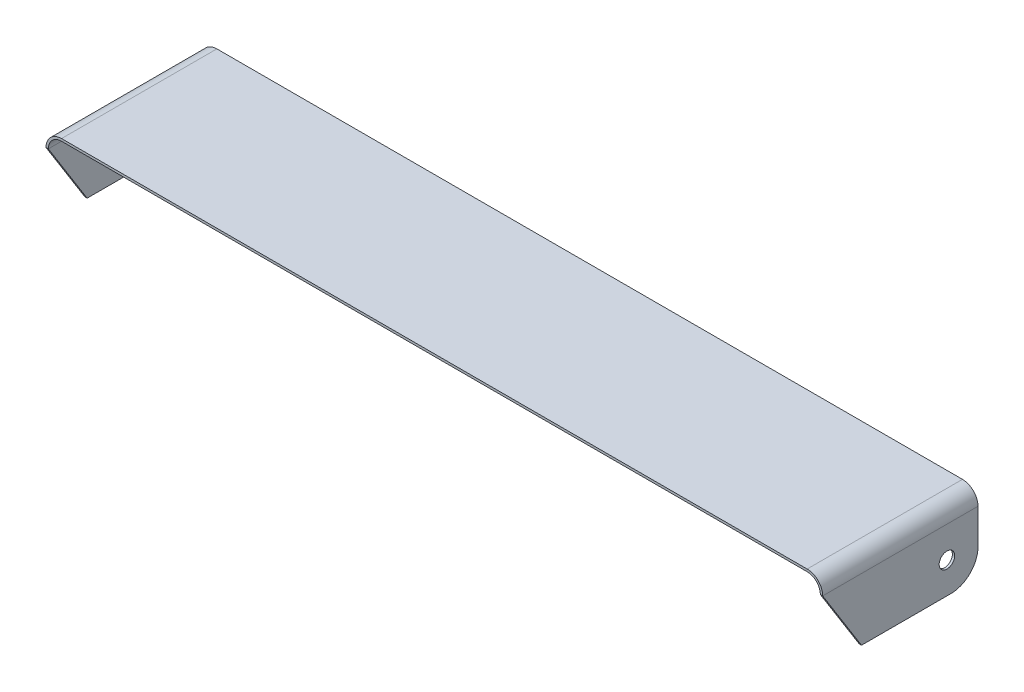
ISO-10303-21;
HEADER;
FILE_DESCRIPTION(('STEP AP214'),'2;1');
FILE_NAME('part.step','',(''),(''),'','','');
FILE_SCHEMA(('AUTOMOTIVE_DESIGN { 1 0 10303 214 1 1 1 1 }'));
ENDSEC;
DATA;
#1=APPLICATION_CONTEXT('core data for automotive mechanical design processes');
#2=APPLICATION_PROTOCOL_DEFINITION('international standard','automotive_design',2000,#1);
#3=PRODUCT_CONTEXT('',#1,'mechanical');
#4=PRODUCT('Part','Part','',(#3));
#5=PRODUCT_RELATED_PRODUCT_CATEGORY('part','',(#4));
#6=PRODUCT_DEFINITION_FORMATION('','',#4);
#7=PRODUCT_DEFINITION_CONTEXT('part definition',#1,'design');
#8=PRODUCT_DEFINITION('design','',#6,#7);
#9=PRODUCT_DEFINITION_SHAPE('','',#8);
#10=(LENGTH_UNIT() NAMED_UNIT(*) SI_UNIT(.MILLI.,.METRE.));
#11=(NAMED_UNIT(*) PLANE_ANGLE_UNIT() SI_UNIT($,.RADIAN.));
#12=(NAMED_UNIT(*) SI_UNIT($,.STERADIAN.) SOLID_ANGLE_UNIT());
#13=UNCERTAINTY_MEASURE_WITH_UNIT(LENGTH_MEASURE(1.E-05),#10,'distance_accuracy_value','');
#14=(GEOMETRIC_REPRESENTATION_CONTEXT(3) GLOBAL_UNCERTAINTY_ASSIGNED_CONTEXT((#13)) GLOBAL_UNIT_ASSIGNED_CONTEXT((#10,
#11,#12)) REPRESENTATION_CONTEXT('',''));
#15=CARTESIAN_POINT('',(0.,0.,0.));
#16=DIRECTION('',(0.,0.,1.));
#17=DIRECTION('',(1.,0.,0.));
#18=AXIS2_PLACEMENT_3D('',#15,#16,#17);
#19=CARTESIAN_POINT('',(-500.,0.,100.));
#20=DIRECTION('',(0.,1.,0.));
#21=DIRECTION('',(0.,0.,1.));
#22=AXIS2_PLACEMENT_3D('',#19,#20,#21);
#23=PLANE('',#22);
#24=DIRECTION('',(0.,0.,-1.));
#25=VECTOR('',#24,1.);
#26=CARTESIAN_POINT('',(-500.,0.,100.));
#27=LINE('',#26,#25);
#28=CARTESIAN_POINT('',(-500.,0.,50.));
#29=VERTEX_POINT('',#28);
#30=CARTESIAN_POINT('',(-500.,0.,-65.));
#31=VERTEX_POINT('',#30);
#32=EDGE_CURVE('E161',#29,#31,#27,.T.);
#33=ORIENTED_EDGE('',*,*,#32,.T.);
#34=DIRECTION('',(1.,0.,0.));
#35=VECTOR('',#34,1.);
#36=CARTESIAN_POINT('',(-497.,0.,-65.));
#37=LINE('',#36,#35);
#38=CARTESIAN_POINT('',(-497.,0.,-65.));
#39=VERTEX_POINT('',#38);
#40=EDGE_CURVE('E226',#31,#39,#37,.T.);
#41=ORIENTED_EDGE('',*,*,#40,.T.);
#42=DIRECTION('',(0.,0.,-1.));
#43=VECTOR('',#42,1.);
#44=CARTESIAN_POINT('',(-497.,0.,100.));
#45=LINE('',#44,#43);
#46=CARTESIAN_POINT('',(-497.,0.,50.));
#47=VERTEX_POINT('',#46);
#48=EDGE_CURVE('E218',#47,#39,#45,.T.);
#49=ORIENTED_EDGE('',*,*,#48,.F.);
#50=DIRECTION('',(1.,0.,0.));
#51=VECTOR('',#50,1.);
#52=CARTESIAN_POINT('',(-500.,0.,50.));
#53=LINE('',#52,#51);
#54=EDGE_CURVE('E272',#29,#47,#53,.T.);
#55=ORIENTED_EDGE('',*,*,#54,.F.);
#56=EDGE_LOOP('',(#33,#41,#49,#55));
#57=FACE_BOUND('',#56,.T.);
#58=ADVANCED_FACE('F38',(#57),#23,.F.);
#59=CARTESIAN_POINT('',(-497.,0.,100.));
#60=DIRECTION('',(-1.,0.,0.));
#61=DIRECTION('',(0.,0.,1.));
#62=AXIS2_PLACEMENT_3D('',#59,#60,#61);
#63=PLANE('',#62);
#64=CARTESIAN_POINT('',(-497.,40.,-60.));
#65=DIRECTION('',(-1.,0.,0.));
#66=DIRECTION('',(0.,0.,1.));
#67=AXIS2_PLACEMENT_3D('',#64,#65,#66);
#68=CIRCLE('',#67,10.);
#69=CARTESIAN_POINT('',(-497.,40.,-50.));
#70=VERTEX_POINT('',#69);
#71=EDGE_CURVE('E364',#70,#70,#68,.T.);
#72=ORIENTED_EDGE('',*,*,#71,.T.);
#73=EDGE_LOOP('',(#72));
#74=FACE_BOUND('',#73,.T.);
#75=ORIENTED_EDGE('',*,*,#48,.T.);
#76=CARTESIAN_POINT('',(-497.,35.,-65.));
#77=DIRECTION('',(-1.,0.,0.));
#78=DIRECTION('',(0.,0.,1.));
#79=AXIS2_PLACEMENT_3D('',#76,#77,#78);
#80=CIRCLE('',#79,35.);
#81=CARTESIAN_POINT('',(-497.,35.,-100.));
#82=VERTEX_POINT('',#81);
#83=EDGE_CURVE('E230',#39,#82,#80,.F.);
#84=ORIENTED_EDGE('',*,*,#83,.T.);
#85=DIRECTION('',(0.,1.,0.));
#86=VECTOR('',#85,1.);
#87=CARTESIAN_POINT('',(-497.,0.,-100.));
#88=LINE('',#87,#86);
#89=CARTESIAN_POINT('',(-497.,79.9999999999999,-100.));
#90=VERTEX_POINT('',#89);
#91=EDGE_CURVE('E319',#82,#90,#88,.T.);
#92=ORIENTED_EDGE('',*,*,#91,.T.);
#93=DIRECTION('',(0.,0.,-1.));
#94=VECTOR('',#93,1.);
#95=CARTESIAN_POINT('',(-497.,79.9999999999999,100.));
#96=LINE('',#95,#94);
#97=CARTESIAN_POINT('',(-497.,79.9999999999999,100.));
#98=VERTEX_POINT('',#97);
#99=EDGE_CURVE('E214',#98,#90,#96,.T.);
#100=ORIENTED_EDGE('',*,*,#99,.F.);
#101=DIRECTION('',(0.,-0.847998304005088,-0.529998940003181));
#102=VECTOR('',#101,1.);
#103=CARTESIAN_POINT('',(-497.,22.4719101123596,64.0449438202248));
#104=LINE('',#103,#102);
#105=EDGE_CURVE('E145',#98,#47,#104,.T.);
#106=ORIENTED_EDGE('',*,*,#105,.T.);
#107=EDGE_LOOP('',(#75,#84,#92,#100,#106));
#108=FACE_BOUND('',#107,.T.);
#109=ADVANCED_FACE('F334',(#74,#108),#63,.F.);
#110=CARTESIAN_POINT('',(-480.,80.,100.));
#111=DIRECTION('',(0.,0.,-1.));
#112=DIRECTION('',(-1.,0.,0.));
#113=AXIS2_PLACEMENT_3D('',#110,#111,#112);
#114=CYLINDRICAL_SURFACE('',#113,17.);
#115=CARTESIAN_POINT('',(-480.,80.,-100.));
#116=DIRECTION('',(0.,0.,-1.));
#117=DIRECTION('',(-1.,0.,0.));
#118=AXIS2_PLACEMENT_3D('',#115,#116,#117);
#119=CIRCLE('',#118,17.);
#120=CARTESIAN_POINT('',(-480.,97.,-100.));
#121=VERTEX_POINT('',#120);
#122=EDGE_CURVE('E293',#90,#121,#119,.T.);
#123=ORIENTED_EDGE('',*,*,#122,.T.);
#124=DIRECTION('',(0.,0.,-1.));
#125=VECTOR('',#124,1.);
#126=CARTESIAN_POINT('',(-480.,97.,100.));
#127=LINE('',#126,#125);
#128=CARTESIAN_POINT('',(-480.,97.,100.));
#129=VERTEX_POINT('',#128);
#130=EDGE_CURVE('E210',#129,#121,#127,.T.);
#131=ORIENTED_EDGE('',*,*,#130,.F.);
#132=CARTESIAN_POINT('',(-480.,80.,100.));
#133=DIRECTION('',(0.,0.,-1.));
#134=DIRECTION('',(-1.,0.,0.));
#135=AXIS2_PLACEMENT_3D('',#132,#133,#134);
#136=CIRCLE('',#135,17.);
#137=EDGE_CURVE('E305',#98,#129,#136,.T.);
#138=ORIENTED_EDGE('',*,*,#137,.F.);
#139=ORIENTED_EDGE('',*,*,#99,.T.);
#140=EDGE_LOOP('',(#123,#131,#138,#139));
#141=FACE_BOUND('',#140,.T.);
#142=ADVANCED_FACE('F324',(#141),#114,.F.);
#143=CARTESIAN_POINT('',(-480.,97.,100.));
#144=DIRECTION('',(0.,1.,0.));
#145=DIRECTION('',(-1.,0.,0.));
#146=AXIS2_PLACEMENT_3D('',#143,#144,#145);
#147=PLANE('',#146);
#148=DIRECTION('',(1.,0.,0.));
#149=VECTOR('',#148,1.);
#150=CARTESIAN_POINT('',(-480.,97.,-100.));
#151=LINE('',#150,#149);
#152=CARTESIAN_POINT('',(480.,97.,-100.));
#153=VERTEX_POINT('',#152);
#154=EDGE_CURVE('E288',#121,#153,#151,.T.);
#155=ORIENTED_EDGE('',*,*,#154,.T.);
#156=DIRECTION('',(0.,0.,-1.));
#157=VECTOR('',#156,1.);
#158=CARTESIAN_POINT('',(480.,97.,100.));
#159=LINE('',#158,#157);
#160=CARTESIAN_POINT('',(480.,97.,100.));
#161=VERTEX_POINT('',#160);
#162=EDGE_CURVE('E206',#161,#153,#159,.T.);
#163=ORIENTED_EDGE('',*,*,#162,.F.);
#164=DIRECTION('',(1.,0.,0.));
#165=VECTOR('',#164,1.);
#166=CARTESIAN_POINT('',(-480.,97.,100.));
#167=LINE('',#166,#165);
#168=EDGE_CURVE('E277',#129,#161,#167,.T.);
#169=ORIENTED_EDGE('',*,*,#168,.F.);
#170=ORIENTED_EDGE('',*,*,#130,.T.);
#171=EDGE_LOOP('',(#155,#163,#169,#170));
#172=FACE_BOUND('',#171,.T.);
#173=ADVANCED_FACE('F326',(#172),#147,.F.);
#174=CARTESIAN_POINT('',(480.,80.,100.));
#175=DIRECTION('',(0.,0.,-1.));
#176=DIRECTION('',(-1.,0.,0.));
#177=AXIS2_PLACEMENT_3D('',#174,#175,#176);
#178=CYLINDRICAL_SURFACE('',#177,17.);
#179=CARTESIAN_POINT('',(480.,80.,-100.));
#180=DIRECTION('',(0.,0.,-1.));
#181=DIRECTION('',(-1.,0.,0.));
#182=AXIS2_PLACEMENT_3D('',#179,#180,#181);
#183=CIRCLE('',#182,17.);
#184=CARTESIAN_POINT('',(497.,79.9999999999999,-100.));
#185=VERTEX_POINT('',#184);
#186=EDGE_CURVE('E285',#153,#185,#183,.T.);
#187=ORIENTED_EDGE('',*,*,#186,.T.);
#188=DIRECTION('',(0.,0.,-1.));
#189=VECTOR('',#188,1.);
#190=CARTESIAN_POINT('',(497.,79.9999999999999,100.));
#191=LINE('',#190,#189);
#192=CARTESIAN_POINT('',(497.,79.9999999999999,100.));
#193=VERTEX_POINT('',#192);
#194=EDGE_CURVE('E202',#193,#185,#191,.T.);
#195=ORIENTED_EDGE('',*,*,#194,.F.);
#196=CARTESIAN_POINT('',(480.,80.,100.));
#197=DIRECTION('',(0.,0.,-1.));
#198=DIRECTION('',(-1.,0.,0.));
#199=AXIS2_PLACEMENT_3D('',#196,#197,#198);
#200=CIRCLE('',#199,17.);
#201=EDGE_CURVE('E275',#161,#193,#200,.T.);
#202=ORIENTED_EDGE('',*,*,#201,.F.);
#203=ORIENTED_EDGE('',*,*,#162,.T.);
#204=EDGE_LOOP('',(#187,#195,#202,#203));
#205=FACE_BOUND('',#204,.T.);
#206=ADVANCED_FACE('F283',(#205),#178,.F.);
#207=CARTESIAN_POINT('',(497.,79.9999999999999,100.));
#208=DIRECTION('',(1.,0.,0.));
#209=DIRECTION('',(0.,0.,-1.));
#210=AXIS2_PLACEMENT_3D('',#207,#208,#209);
#211=PLANE('',#210);
#212=CARTESIAN_POINT('',(497.,40.,-60.));
#213=DIRECTION('',(1.,0.,0.));
#214=DIRECTION('',(0.,0.,-1.));
#215=AXIS2_PLACEMENT_3D('',#212,#213,#214);
#216=CIRCLE('',#215,10.);
#217=CARTESIAN_POINT('',(497.,40.,-70.));
#218=VERTEX_POINT('',#217);
#219=EDGE_CURVE('E369',#218,#218,#216,.T.);
#220=ORIENTED_EDGE('',*,*,#219,.T.);
#221=EDGE_LOOP('',(#220));
#222=FACE_BOUND('',#221,.T.);
#223=DIRECTION('',(0.,-1.,0.));
#224=VECTOR('',#223,1.);
#225=CARTESIAN_POINT('',(497.,79.9999999999999,-100.));
#226=LINE('',#225,#224);
#227=CARTESIAN_POINT('',(497.,35.,-100.));
#228=VERTEX_POINT('',#227);
#229=EDGE_CURVE('E260',#185,#228,#226,.T.);
#230=ORIENTED_EDGE('',*,*,#229,.T.);
#231=CARTESIAN_POINT('',(497.,35.,-65.));
#232=DIRECTION('',(1.,0.,0.));
#233=DIRECTION('',(0.,0.,-1.));
#234=AXIS2_PLACEMENT_3D('',#231,#232,#233);
#235=CIRCLE('',#234,35.);
#236=CARTESIAN_POINT('',(497.,0.,-65.));
#237=VERTEX_POINT('',#236);
#238=EDGE_CURVE('E11',#228,#237,#235,.F.);
#239=ORIENTED_EDGE('',*,*,#238,.T.);
#240=DIRECTION('',(0.,0.,-1.));
#241=VECTOR('',#240,1.);
#242=CARTESIAN_POINT('',(497.,0.,100.));
#243=LINE('',#242,#241);
#244=CARTESIAN_POINT('',(497.,0.,50.));
#245=VERTEX_POINT('',#244);
#246=EDGE_CURVE('E199',#245,#237,#243,.T.);
#247=ORIENTED_EDGE('',*,*,#246,.F.);
#248=DIRECTION('',(0.,0.847998304005088,0.529998940003181));
#249=VECTOR('',#248,1.);
#250=CARTESIAN_POINT('',(497.,79.9999999999999,100.));
#251=LINE('',#250,#249);
#252=EDGE_CURVE('E267',#245,#193,#251,.T.);
#253=ORIENTED_EDGE('',*,*,#252,.T.);
#254=ORIENTED_EDGE('',*,*,#194,.T.);
#255=EDGE_LOOP('',(#230,#239,#247,#253,#254));
#256=FACE_BOUND('',#255,.T.);
#257=ADVANCED_FACE('F266',(#222,#256),#211,.F.);
#258=CARTESIAN_POINT('',(497.,0.,100.));
#259=DIRECTION('',(0.,1.,0.));
#260=DIRECTION('',(0.,0.,1.));
#261=AXIS2_PLACEMENT_3D('',#258,#259,#260);
#262=PLANE('',#261);
#263=ORIENTED_EDGE('',*,*,#246,.T.);
#264=DIRECTION('',(1.,0.,0.));
#265=VECTOR('',#264,1.);
#266=CARTESIAN_POINT('',(500.,0.,-65.));
#267=LINE('',#266,#265);
#268=CARTESIAN_POINT('',(500.,0.,-65.));
#269=VERTEX_POINT('',#268);
#270=EDGE_CURVE('E242',#237,#269,#267,.T.);
#271=ORIENTED_EDGE('',*,*,#270,.T.);
#272=DIRECTION('',(0.,0.,-1.));
#273=VECTOR('',#272,1.);
#274=CARTESIAN_POINT('',(500.,0.,100.));
#275=LINE('',#274,#273);
#276=CARTESIAN_POINT('',(500.,0.,50.));
#277=VERTEX_POINT('',#276);
#278=EDGE_CURVE('E195',#277,#269,#275,.T.);
#279=ORIENTED_EDGE('',*,*,#278,.F.);
#280=EDGE_CURVE('E150',#245,#277,#53,.T.);
#281=ORIENTED_EDGE('',*,*,#280,.F.);
#282=EDGE_LOOP('',(#263,#271,#279,#281));
#283=FACE_BOUND('',#282,.T.);
#284=ADVANCED_FACE('F263',(#283),#262,.F.);
#285=CARTESIAN_POINT('',(500.,79.9999999999999,100.));
#286=DIRECTION('',(-1.,0.,0.));
#287=DIRECTION('',(0.,0.,1.));
#288=AXIS2_PLACEMENT_3D('',#285,#286,#287);
#289=PLANE('',#288);
#290=CARTESIAN_POINT('',(500.,40.,-60.));
#291=DIRECTION('',(-1.,0.,0.));
#292=DIRECTION('',(0.,0.,1.));
#293=AXIS2_PLACEMENT_3D('',#290,#291,#292);
#294=CIRCLE('',#293,10.);
#295=CARTESIAN_POINT('',(500.,40.,-50.));
#296=VERTEX_POINT('',#295);
#297=EDGE_CURVE('E373',#296,#296,#294,.T.);
#298=ORIENTED_EDGE('',*,*,#297,.T.);
#299=EDGE_LOOP('',(#298));
#300=FACE_BOUND('',#299,.T.);
#301=ORIENTED_EDGE('',*,*,#278,.T.);
#302=CARTESIAN_POINT('',(500.,35.,-65.));
#303=DIRECTION('',(-1.,0.,0.));
#304=DIRECTION('',(0.,0.,1.));
#305=AXIS2_PLACEMENT_3D('',#302,#303,#304);
#306=CIRCLE('',#305,35.);
#307=CARTESIAN_POINT('',(500.,35.,-100.));
#308=VERTEX_POINT('',#307);
#309=EDGE_CURVE('E47',#269,#308,#306,.F.);
#310=ORIENTED_EDGE('',*,*,#309,.T.);
#311=DIRECTION('',(0.,1.,0.));
#312=VECTOR('',#311,1.);
#313=CARTESIAN_POINT('',(500.,79.9999999999999,-100.));
#314=LINE('',#313,#312);
#315=CARTESIAN_POINT('',(500.,79.9999999999999,-100.));
#316=VERTEX_POINT('',#315);
#317=EDGE_CURVE('E249',#308,#316,#314,.T.);
#318=ORIENTED_EDGE('',*,*,#317,.T.);
#319=DIRECTION('',(0.,0.,-1.));
#320=VECTOR('',#319,1.);
#321=CARTESIAN_POINT('',(500.,79.9999999999999,100.));
#322=LINE('',#321,#320);
#323=CARTESIAN_POINT('',(500.,79.9999999999999,100.));
#324=VERTEX_POINT('',#323);
#325=EDGE_CURVE('E191',#324,#316,#322,.T.);
#326=ORIENTED_EDGE('',*,*,#325,.F.);
#327=DIRECTION('',(0.,0.847998304005088,0.529998940003181));
#328=VECTOR('',#327,1.);
#329=CARTESIAN_POINT('',(500.,0.,50.));
#330=LINE('',#329,#328);
#331=EDGE_CURVE('E163',#277,#324,#330,.T.);
#332=ORIENTED_EDGE('',*,*,#331,.F.);
#333=EDGE_LOOP('',(#301,#310,#318,#326,#332));
#334=FACE_BOUND('',#333,.T.);
#335=ADVANCED_FACE('F247',(#300,#334),#289,.F.);
#336=CARTESIAN_POINT('',(480.,80.,100.));
#337=DIRECTION('',(0.,0.,-1.));
#338=DIRECTION('',(-1.,0.,0.));
#339=AXIS2_PLACEMENT_3D('',#336,#337,#338);
#340=CYLINDRICAL_SURFACE('',#339,20.);
#341=CARTESIAN_POINT('',(480.,80.,-100.));
#342=DIRECTION('',(0.,0.,1.));
#343=DIRECTION('',(-1.,0.,0.));
#344=AXIS2_PLACEMENT_3D('',#341,#342,#343);
#345=CIRCLE('',#344,20.);
#346=CARTESIAN_POINT('',(480.,100.,-100.));
#347=VERTEX_POINT('',#346);
#348=EDGE_CURVE('E258',#316,#347,#345,.T.);
#349=ORIENTED_EDGE('',*,*,#348,.T.);
#350=DIRECTION('',(0.,0.,-1.));
#351=VECTOR('',#350,1.);
#352=CARTESIAN_POINT('',(480.,100.,100.));
#353=LINE('',#352,#351);
#354=CARTESIAN_POINT('',(480.,100.,100.));
#355=VERTEX_POINT('',#354);
#356=EDGE_CURVE('E183',#355,#347,#353,.T.);
#357=ORIENTED_EDGE('',*,*,#356,.F.);
#358=CARTESIAN_POINT('',(480.,80.,100.));
#359=DIRECTION('',(0.,0.,1.));
#360=DIRECTION('',(-1.,0.,0.));
#361=AXIS2_PLACEMENT_3D('',#358,#359,#360);
#362=CIRCLE('',#361,20.);
#363=EDGE_CURVE('E281',#324,#355,#362,.T.);
#364=ORIENTED_EDGE('',*,*,#363,.F.);
#365=ORIENTED_EDGE('',*,*,#325,.T.);
#366=EDGE_LOOP('',(#349,#357,#364,#365));
#367=FACE_BOUND('',#366,.T.);
#368=ADVANCED_FACE('F394',(#367),#340,.T.);
#369=CARTESIAN_POINT('',(-480.,100.,100.));
#370=DIRECTION('',(0.,-1.,0.));
#371=DIRECTION('',(0.,0.,-1.));
#372=AXIS2_PLACEMENT_3D('',#369,#370,#371);
#373=PLANE('',#372);
#374=DIRECTION('',(-1.,0.,0.));
#375=VECTOR('',#374,1.);
#376=CARTESIAN_POINT('',(-480.,100.,-100.));
#377=LINE('',#376,#375);
#378=CARTESIAN_POINT('',(-480.,100.,-100.));
#379=VERTEX_POINT('',#378);
#380=EDGE_CURVE('E299',#347,#379,#377,.T.);
#381=ORIENTED_EDGE('',*,*,#380,.T.);
#382=DIRECTION('',(0.,0.,-1.));
#383=VECTOR('',#382,1.);
#384=CARTESIAN_POINT('',(-480.,100.,100.));
#385=LINE('',#384,#383);
#386=CARTESIAN_POINT('',(-480.,100.,100.));
#387=VERTEX_POINT('',#386);
#388=EDGE_CURVE('E179',#387,#379,#385,.T.);
#389=ORIENTED_EDGE('',*,*,#388,.F.);
#390=DIRECTION('',(-1.,0.,0.));
#391=VECTOR('',#390,1.);
#392=CARTESIAN_POINT('',(-480.,100.,100.));
#393=LINE('',#392,#391);
#394=EDGE_CURVE('E169',#355,#387,#393,.T.);
#395=ORIENTED_EDGE('',*,*,#394,.F.);
#396=ORIENTED_EDGE('',*,*,#356,.T.);
#397=EDGE_LOOP('',(#381,#389,#395,#396));
#398=FACE_BOUND('',#397,.T.);
#399=ADVANCED_FACE('F397',(#398),#373,.F.);
#400=CARTESIAN_POINT('',(-480.,80.,100.));
#401=DIRECTION('',(0.,0.,-1.));
#402=DIRECTION('',(-1.,0.,0.));
#403=AXIS2_PLACEMENT_3D('',#400,#401,#402);
#404=CYLINDRICAL_SURFACE('',#403,20.);
#405=CARTESIAN_POINT('',(-480.,80.,-100.));
#406=DIRECTION('',(0.,0.,1.));
#407=DIRECTION('',(-1.,0.,0.));
#408=AXIS2_PLACEMENT_3D('',#405,#406,#407);
#409=CIRCLE('',#408,20.);
#410=CARTESIAN_POINT('',(-500.,79.9999999999999,-100.));
#411=VERTEX_POINT('',#410);
#412=EDGE_CURVE('E177',#379,#411,#409,.T.);
#413=ORIENTED_EDGE('',*,*,#412,.T.);
#414=DIRECTION('',(0.,0.,-1.));
#415=VECTOR('',#414,1.);
#416=CARTESIAN_POINT('',(-500.,79.9999999999999,100.));
#417=LINE('',#416,#415);
#418=CARTESIAN_POINT('',(-500.,79.9999999999999,100.));
#419=VERTEX_POINT('',#418);
#420=EDGE_CURVE('E158',#419,#411,#417,.T.);
#421=ORIENTED_EDGE('',*,*,#420,.F.);
#422=CARTESIAN_POINT('',(-480.,80.,100.));
#423=DIRECTION('',(0.,0.,1.));
#424=DIRECTION('',(-1.,0.,0.));
#425=AXIS2_PLACEMENT_3D('',#422,#423,#424);
#426=CIRCLE('',#425,20.);
#427=EDGE_CURVE('E166',#387,#419,#426,.T.);
#428=ORIENTED_EDGE('',*,*,#427,.F.);
#429=ORIENTED_EDGE('',*,*,#388,.T.);
#430=EDGE_LOOP('',(#413,#421,#428,#429));
#431=FACE_BOUND('',#430,.T.);
#432=ADVANCED_FACE('F175',(#431),#404,.T.);
#433=CARTESIAN_POINT('',(-500.,0.,100.));
#434=DIRECTION('',(1.,0.,0.));
#435=DIRECTION('',(0.,0.,-1.));
#436=AXIS2_PLACEMENT_3D('',#433,#434,#435);
#437=PLANE('',#436);
#438=CARTESIAN_POINT('',(-500.,40.,-60.));
#439=DIRECTION('',(-1.,0.,0.));
#440=DIRECTION('',(0.,0.,1.));
#441=AXIS2_PLACEMENT_3D('',#438,#439,#440);
#442=CIRCLE('',#441,10.);
#443=CARTESIAN_POINT('',(-500.,40.,-50.));
#444=VERTEX_POINT('',#443);
#445=EDGE_CURVE('E374',#444,#444,#442,.T.);
#446=ORIENTED_EDGE('',*,*,#445,.F.);
#447=EDGE_LOOP('',(#446));
#448=FACE_BOUND('',#447,.T.);
#449=DIRECTION('',(0.,-1.,0.));
#450=VECTOR('',#449,1.);
#451=CARTESIAN_POINT('',(-500.,0.,-100.));
#452=LINE('',#451,#450);
#453=CARTESIAN_POINT('',(-500.,35.,-100.));
#454=VERTEX_POINT('',#453);
#455=EDGE_CURVE('E303',#411,#454,#452,.T.);
#456=ORIENTED_EDGE('',*,*,#455,.T.);
#457=CARTESIAN_POINT('',(-500.,35.,-65.));
#458=DIRECTION('',(1.,0.,0.));
#459=DIRECTION('',(0.,0.,-1.));
#460=AXIS2_PLACEMENT_3D('',#457,#458,#459);
#461=CIRCLE('',#460,35.);
#462=EDGE_CURVE('E239',#454,#31,#461,.F.);
#463=ORIENTED_EDGE('',*,*,#462,.T.);
#464=ORIENTED_EDGE('',*,*,#32,.F.);
#465=DIRECTION('',(0.,0.847998304005088,0.529998940003181));
#466=VECTOR('',#465,1.);
#467=CARTESIAN_POINT('',(-500.,0.,50.));
#468=LINE('',#467,#466);
#469=EDGE_CURVE('E142',#29,#419,#468,.T.);
#470=ORIENTED_EDGE('',*,*,#469,.T.);
#471=ORIENTED_EDGE('',*,*,#420,.T.);
#472=EDGE_LOOP('',(#456,#463,#464,#470,#471));
#473=FACE_BOUND('',#472,.T.);
#474=ADVANCED_FACE('F156',(#448,#473),#437,.F.);
#475=CARTESIAN_POINT('',(-480.,80.,100.));
#476=DIRECTION('',(0.,0.,-1.));
#477=DIRECTION('',(-1.,0.,0.));
#478=AXIS2_PLACEMENT_3D('',#475,#476,#477);
#479=PLANE('',#478);
#480=ORIENTED_EDGE('',*,*,#427,.T.);
#481=DIRECTION('',(1.,0.,0.));
#482=VECTOR('',#481,1.);
#483=CARTESIAN_POINT('',(-500.,79.9999999999999,100.));
#484=LINE('',#483,#482);
#485=EDGE_CURVE('E139',#419,#98,#484,.T.);
#486=ORIENTED_EDGE('',*,*,#485,.T.);
#487=ORIENTED_EDGE('',*,*,#137,.T.);
#488=ORIENTED_EDGE('',*,*,#168,.T.);
#489=ORIENTED_EDGE('',*,*,#201,.T.);
#490=DIRECTION('',(1.,0.,0.));
#491=VECTOR('',#490,1.);
#492=CARTESIAN_POINT('',(-480.,80.,100.));
#493=LINE('',#492,#491);
#494=EDGE_CURVE('E222',#193,#324,#493,.T.);
#495=ORIENTED_EDGE('',*,*,#494,.T.);
#496=ORIENTED_EDGE('',*,*,#363,.T.);
#497=ORIENTED_EDGE('',*,*,#394,.T.);
#498=EDGE_LOOP('',(#480,#486,#487,#488,#489,#495,#496,#497));
#499=FACE_BOUND('',#498,.T.);
#500=ADVANCED_FACE('F167',(#499),#479,.F.);
#501=CARTESIAN_POINT('',(-480.,80.,-100.));
#502=DIRECTION('',(0.,0.,-1.));
#503=DIRECTION('',(-1.,0.,0.));
#504=AXIS2_PLACEMENT_3D('',#501,#502,#503);
#505=PLANE('',#504);
#506=ORIENTED_EDGE('',*,*,#91,.F.);
#507=DIRECTION('',(1.,0.,0.));
#508=VECTOR('',#507,1.);
#509=CARTESIAN_POINT('',(-500.,35.,-100.));
#510=LINE('',#509,#508);
#511=EDGE_CURVE('E236',#82,#454,#510,.F.);
#512=ORIENTED_EDGE('',*,*,#511,.T.);
#513=ORIENTED_EDGE('',*,*,#455,.F.);
#514=ORIENTED_EDGE('',*,*,#412,.F.);
#515=ORIENTED_EDGE('',*,*,#380,.F.);
#516=ORIENTED_EDGE('',*,*,#348,.F.);
#517=ORIENTED_EDGE('',*,*,#317,.F.);
#518=DIRECTION('',(1.,0.,0.));
#519=VECTOR('',#518,1.);
#520=CARTESIAN_POINT('',(497.,35.,-100.));
#521=LINE('',#520,#519);
#522=EDGE_CURVE('E233',#308,#228,#521,.F.);
#523=ORIENTED_EDGE('',*,*,#522,.T.);
#524=ORIENTED_EDGE('',*,*,#229,.F.);
#525=ORIENTED_EDGE('',*,*,#186,.F.);
#526=ORIENTED_EDGE('',*,*,#154,.F.);
#527=ORIENTED_EDGE('',*,*,#122,.F.);
#528=EDGE_LOOP('',(#506,#512,#513,#514,#515,#516,#517,#523,#524,#525,#526,#527));
#529=FACE_BOUND('',#528,.T.);
#530=ADVANCED_FACE('F255',(#529),#505,.T.);
#531=CARTESIAN_POINT('',(-500.,0.,50.));
#532=DIRECTION('',(0.,0.529998940003181,-0.847998304005088));
#533=DIRECTION('',(0.,0.847998304005088,0.529998940003181));
#534=AXIS2_PLACEMENT_3D('',#531,#532,#533);
#535=PLANE('',#534);
#536=ORIENTED_EDGE('',*,*,#280,.T.);
#537=ORIENTED_EDGE('',*,*,#331,.T.);
#538=ORIENTED_EDGE('',*,*,#494,.F.);
#539=ORIENTED_EDGE('',*,*,#252,.F.);
#540=EDGE_LOOP('',(#536,#537,#538,#539));
#541=FACE_BOUND('',#540,.T.);
#542=ADVANCED_FACE('F409',(#541),#535,.F.);
#543=ORIENTED_EDGE('',*,*,#485,.F.);
#544=ORIENTED_EDGE('',*,*,#469,.F.);
#545=ORIENTED_EDGE('',*,*,#54,.T.);
#546=ORIENTED_EDGE('',*,*,#105,.F.);
#547=EDGE_LOOP('',(#543,#544,#545,#546));
#548=FACE_BOUND('',#547,.T.);
#549=ADVANCED_FACE('F141',(#548),#535,.F.);
#550=CARTESIAN_POINT('',(500.,40.,-60.));
#551=DIRECTION('',(-1.,0.,0.));
#552=DIRECTION('',(0.,0.,1.));
#553=AXIS2_PLACEMENT_3D('',#550,#551,#552);
#554=CYLINDRICAL_SURFACE('',#553,10.);
#555=ORIENTED_EDGE('',*,*,#445,.T.);
#556=EDGE_LOOP('',(#555));
#557=FACE_BOUND('',#556,.T.);
#558=ORIENTED_EDGE('',*,*,#71,.F.);
#559=EDGE_LOOP('',(#558));
#560=FACE_BOUND('',#559,.T.);
#561=ADVANCED_FACE('F353',(#557,#560),#554,.F.);
#562=ORIENTED_EDGE('',*,*,#297,.F.);
#563=EDGE_LOOP('',(#562));
#564=FACE_BOUND('',#563,.T.);
#565=ORIENTED_EDGE('',*,*,#219,.F.);
#566=EDGE_LOOP('',(#565));
#567=FACE_BOUND('',#566,.T.);
#568=ADVANCED_FACE('F347',(#564,#567),#554,.F.);
#569=CARTESIAN_POINT('',(-500.,35.,-65.));
#570=DIRECTION('',(-1.,0.,0.));
#571=DIRECTION('',(0.,0.,1.));
#572=AXIS2_PLACEMENT_3D('',#569,#570,#571);
#573=CYLINDRICAL_SURFACE('',#572,35.);
#574=ORIENTED_EDGE('',*,*,#462,.F.);
#575=ORIENTED_EDGE('',*,*,#511,.F.);
#576=ORIENTED_EDGE('',*,*,#83,.F.);
#577=ORIENTED_EDGE('',*,*,#40,.F.);
#578=EDGE_LOOP('',(#574,#575,#576,#577));
#579=FACE_BOUND('',#578,.T.);
#580=ADVANCED_FACE('F345',(#579),#573,.T.);
#581=CARTESIAN_POINT('',(497.,35.,-65.));
#582=DIRECTION('',(-1.,0.,0.));
#583=DIRECTION('',(0.,0.,1.));
#584=AXIS2_PLACEMENT_3D('',#581,#582,#583);
#585=CYLINDRICAL_SURFACE('',#584,35.);
#586=ORIENTED_EDGE('',*,*,#238,.F.);
#587=ORIENTED_EDGE('',*,*,#522,.F.);
#588=ORIENTED_EDGE('',*,*,#309,.F.);
#589=ORIENTED_EDGE('',*,*,#270,.F.);
#590=EDGE_LOOP('',(#586,#587,#588,#589));
#591=FACE_BOUND('',#590,.T.);
#592=ADVANCED_FACE('F40',(#591),#585,.T.);
#593=CLOSED_SHELL('',(#58,#109,#142,#173,#206,#257,#284,#335,#368,#399,#432,#474,#500,#530,#542,
#549,#561,#568,#580,#592));
#594=MANIFOLD_SOLID_BREP('B2',#593);
#595=ADVANCED_BREP_SHAPE_REPRESENTATION('',(#18,#594),#14);
#596=SHAPE_DEFINITION_REPRESENTATION(#9,#595);
ENDSEC;
END-ISO-10303-21;
